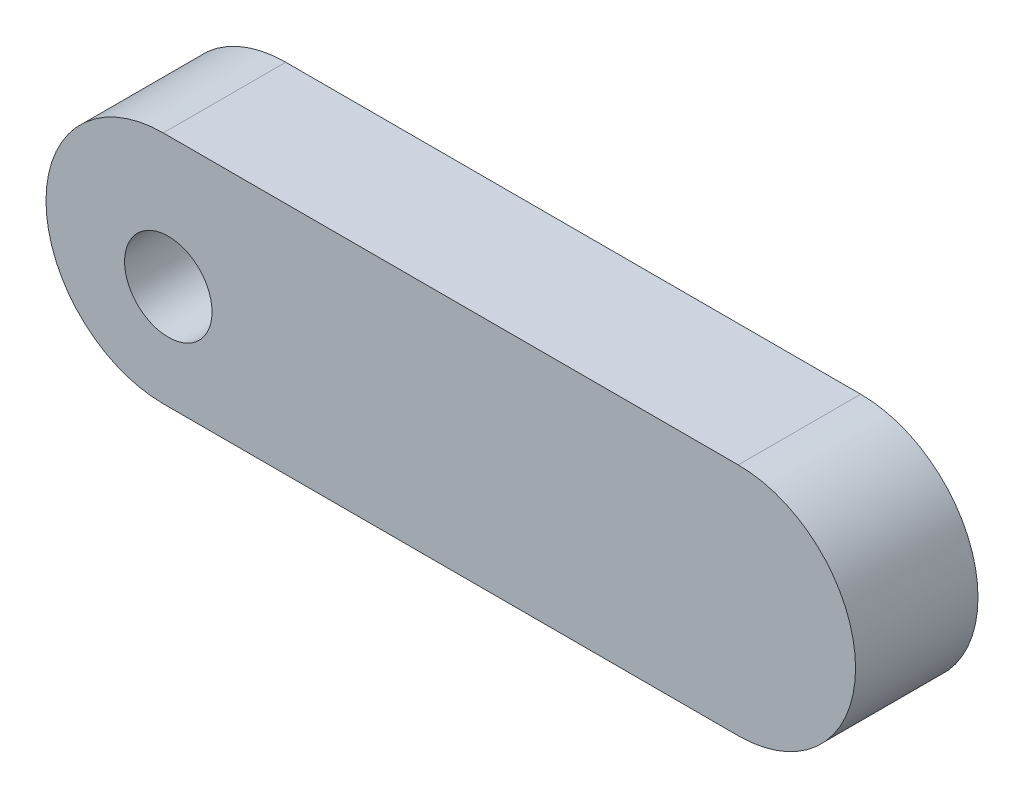
ISO-10303-21;
HEADER;
FILE_DESCRIPTION(('STEP AP214'),'2;1');
FILE_NAME('part.step','',(''),(''),'','','');
FILE_SCHEMA(('AUTOMOTIVE_DESIGN { 1 0 10303 214 1 1 1 1 }'));
ENDSEC;
DATA;
#1=APPLICATION_CONTEXT('core data for automotive mechanical design processes');
#2=APPLICATION_PROTOCOL_DEFINITION('international standard','automotive_design',2000,#1);
#3=PRODUCT_CONTEXT('',#1,'mechanical');
#4=PRODUCT('Part','Part','',(#3));
#5=PRODUCT_RELATED_PRODUCT_CATEGORY('part','',(#4));
#6=PRODUCT_DEFINITION_FORMATION('','',#4);
#7=PRODUCT_DEFINITION_CONTEXT('part definition',#1,'design');
#8=PRODUCT_DEFINITION('design','',#6,#7);
#9=PRODUCT_DEFINITION_SHAPE('','',#8);
#10=(LENGTH_UNIT() NAMED_UNIT(*) SI_UNIT(.MILLI.,.METRE.));
#11=(NAMED_UNIT(*) PLANE_ANGLE_UNIT() SI_UNIT($,.RADIAN.));
#12=(NAMED_UNIT(*) SI_UNIT($,.STERADIAN.) SOLID_ANGLE_UNIT());
#13=UNCERTAINTY_MEASURE_WITH_UNIT(LENGTH_MEASURE(1.E-05),#10,'distance_accuracy_value','');
#14=(GEOMETRIC_REPRESENTATION_CONTEXT(3) GLOBAL_UNCERTAINTY_ASSIGNED_CONTEXT((#13)) GLOBAL_UNIT_ASSIGNED_CONTEXT((#10,
#11,#12)) REPRESENTATION_CONTEXT('',''));
#15=CARTESIAN_POINT('',(0.,0.,0.));
#16=DIRECTION('',(0.,0.,1.));
#17=DIRECTION('',(1.,0.,0.));
#18=AXIS2_PLACEMENT_3D('',#15,#16,#17);
#19=CARTESIAN_POINT('',(0.,31.3770547142888,10.));
#20=DIRECTION('',(0.,1.,0.));
#21=DIRECTION('',(0.,0.,1.));
#22=AXIS2_PLACEMENT_3D('',#19,#20,#21);
#23=PLANE('',#22);
#24=DIRECTION('',(1.,0.,0.));
#25=VECTOR('',#24,1.);
#26=CARTESIAN_POINT('',(0.,31.3770547142888,0.));
#27=LINE('',#26,#25);
#28=CARTESIAN_POINT('',(-68.6434423785487,31.3770547142888,0.));
#29=VERTEX_POINT('',#28);
#30=CARTESIAN_POINT('',(-21.6917034055332,31.3770547142888,0.));
#31=VERTEX_POINT('',#30);
#32=EDGE_CURVE('E139',#29,#31,#27,.T.);
#33=ORIENTED_EDGE('',*,*,#32,.F.);
#34=DIRECTION('',(0.,0.,-1.));
#35=VECTOR('',#34,1.);
#36=CARTESIAN_POINT('',(-68.6434423785487,31.3770547142888,10.));
#37=LINE('',#36,#35);
#38=CARTESIAN_POINT('',(-68.6434423785487,31.3770547142888,10.));
#39=VERTEX_POINT('',#38);
#40=EDGE_CURVE('E99',#39,#29,#37,.T.);
#41=ORIENTED_EDGE('',*,*,#40,.F.);
#42=DIRECTION('',(1.,0.,0.));
#43=VECTOR('',#42,1.);
#44=CARTESIAN_POINT('',(0.,31.3770547142888,10.));
#45=LINE('',#44,#43);
#46=CARTESIAN_POINT('',(-21.6917034055332,31.3770547142888,10.));
#47=VERTEX_POINT('',#46);
#48=EDGE_CURVE('E112',#39,#47,#45,.T.);
#49=ORIENTED_EDGE('',*,*,#48,.T.);
#50=DIRECTION('',(0.,0.,-1.));
#51=VECTOR('',#50,1.);
#52=CARTESIAN_POINT('',(-21.6917034055332,31.3770547142888,10.));
#53=LINE('',#52,#51);
#54=EDGE_CURVE('E75',#47,#31,#53,.T.);
#55=ORIENTED_EDGE('',*,*,#54,.T.);
#56=EDGE_LOOP('',(#33,#41,#49,#55));
#57=FACE_BOUND('',#56,.T.);
#58=ADVANCED_FACE('F65',(#57),#23,.T.);
#59=CARTESIAN_POINT('',(0.,0.,0.));
#60=DIRECTION('',(0.,0.,1.));
#61=DIRECTION('',(1.,0.,0.));
#62=AXIS2_PLACEMENT_3D('',#59,#60,#61);
#63=PLANE('',#62);
#64=CARTESIAN_POINT('',(-68.2340523054714,20.7072039915549,0.));
#65=DIRECTION('',(0.,0.,1.));
#66=DIRECTION('',(1.,0.,0.));
#67=AXIS2_PLACEMENT_3D('',#64,#65,#66);
#68=CIRCLE('',#67,3.5705619411071);
#69=CARTESIAN_POINT('',(-64.6634903643643,20.7072039915549,0.));
#70=VERTEX_POINT('',#69);
#71=EDGE_CURVE('E136',#70,#70,#68,.T.);
#72=ORIENTED_EDGE('',*,*,#71,.T.);
#73=EDGE_LOOP('',(#72));
#74=FACE_BOUND('',#73,.T.);
#75=DIRECTION('',(1.,0.,0.));
#76=VECTOR('',#75,1.);
#77=CARTESIAN_POINT('',(0.,12.2207452132984,0.));
#78=LINE('',#77,#76);
#79=CARTESIAN_POINT('',(-68.6434423785487,12.2207452132984,0.));
#80=VERTEX_POINT('',#79);
#81=CARTESIAN_POINT('',(-21.6917034055332,12.2207452132984,0.));
#82=VERTEX_POINT('',#81);
#83=EDGE_CURVE('E132',#80,#82,#78,.T.);
#84=ORIENTED_EDGE('',*,*,#83,.F.);
#85=CARTESIAN_POINT('',(-68.6434423785487,21.7988999637936,0.));
#86=DIRECTION('',(0.,0.,1.));
#87=DIRECTION('',(1.,0.,0.));
#88=AXIS2_PLACEMENT_3D('',#85,#86,#87);
#89=CIRCLE('',#88,9.57815475049517);
#90=EDGE_CURVE('E102',#29,#80,#89,.T.);
#91=ORIENTED_EDGE('',*,*,#90,.F.);
#92=ORIENTED_EDGE('',*,*,#32,.T.);
#93=CARTESIAN_POINT('',(-21.6917034055332,21.7988999637936,0.));
#94=DIRECTION('',(0.,0.,1.));
#95=DIRECTION('',(1.,0.,0.));
#96=AXIS2_PLACEMENT_3D('',#93,#94,#95);
#97=CIRCLE('',#96,9.57815475049517);
#98=EDGE_CURVE('E120',#82,#31,#97,.T.);
#99=ORIENTED_EDGE('',*,*,#98,.F.);
#100=EDGE_LOOP('',(#84,#91,#92,#99));
#101=FACE_BOUND('',#100,.T.);
#102=ADVANCED_FACE('F150',(#74,#101),#63,.F.);
#103=CARTESIAN_POINT('',(-21.6917034055332,21.7988999637936,10.));
#104=DIRECTION('',(0.,0.,-1.));
#105=DIRECTION('',(-1.,0.,0.));
#106=AXIS2_PLACEMENT_3D('',#103,#104,#105);
#107=CYLINDRICAL_SURFACE('',#106,9.57815475049517);
#108=ORIENTED_EDGE('',*,*,#98,.T.);
#109=ORIENTED_EDGE('',*,*,#54,.F.);
#110=CARTESIAN_POINT('',(-21.6917034055332,21.7988999637936,10.));
#111=DIRECTION('',(0.,0.,1.));
#112=DIRECTION('',(1.,0.,0.));
#113=AXIS2_PLACEMENT_3D('',#110,#111,#112);
#114=CIRCLE('',#113,9.57815475049517);
#115=CARTESIAN_POINT('',(-21.6917034055332,12.2207452132984,10.));
#116=VERTEX_POINT('',#115);
#117=EDGE_CURVE('E109',#116,#47,#114,.T.);
#118=ORIENTED_EDGE('',*,*,#117,.F.);
#119=DIRECTION('',(0.,0.,-1.));
#120=VECTOR('',#119,1.);
#121=CARTESIAN_POINT('',(-21.6917034055332,12.2207452132984,10.));
#122=LINE('',#121,#120);
#123=EDGE_CURVE('E12',#116,#82,#122,.T.);
#124=ORIENTED_EDGE('',*,*,#123,.T.);
#125=EDGE_LOOP('',(#108,#109,#118,#124));
#126=FACE_BOUND('',#125,.T.);
#127=ADVANCED_FACE('F119',(#126),#107,.T.);
#128=CARTESIAN_POINT('',(0.,12.2207452132984,10.));
#129=DIRECTION('',(0.,1.,0.));
#130=DIRECTION('',(0.,0.,1.));
#131=AXIS2_PLACEMENT_3D('',#128,#129,#130);
#132=PLANE('',#131);
#133=ORIENTED_EDGE('',*,*,#83,.T.);
#134=ORIENTED_EDGE('',*,*,#123,.F.);
#135=DIRECTION('',(1.,0.,0.));
#136=VECTOR('',#135,1.);
#137=CARTESIAN_POINT('',(0.,12.2207452132984,10.));
#138=LINE('',#137,#136);
#139=CARTESIAN_POINT('',(-68.6434423785487,12.2207452132984,10.));
#140=VERTEX_POINT('',#139);
#141=EDGE_CURVE('E114',#140,#116,#138,.T.);
#142=ORIENTED_EDGE('',*,*,#141,.F.);
#143=DIRECTION('',(0.,0.,-1.));
#144=VECTOR('',#143,1.);
#145=CARTESIAN_POINT('',(-68.6434423785487,12.2207452132984,10.));
#146=LINE('',#145,#144);
#147=EDGE_CURVE('E128',#140,#80,#146,.T.);
#148=ORIENTED_EDGE('',*,*,#147,.T.);
#149=EDGE_LOOP('',(#133,#134,#142,#148));
#150=FACE_BOUND('',#149,.T.);
#151=ADVANCED_FACE('F67',(#150),#132,.F.);
#152=CARTESIAN_POINT('',(-68.6434423785487,21.7988999637936,10.));
#153=DIRECTION('',(0.,0.,-1.));
#154=DIRECTION('',(-1.,0.,0.));
#155=AXIS2_PLACEMENT_3D('',#152,#153,#154);
#156=CYLINDRICAL_SURFACE('',#155,9.57815475049517);
#157=ORIENTED_EDGE('',*,*,#90,.T.);
#158=ORIENTED_EDGE('',*,*,#147,.F.);
#159=CARTESIAN_POINT('',(-68.6434423785487,21.7988999637936,10.));
#160=DIRECTION('',(0.,0.,1.));
#161=DIRECTION('',(1.,0.,0.));
#162=AXIS2_PLACEMENT_3D('',#159,#160,#161);
#163=CIRCLE('',#162,9.57815475049517);
#164=EDGE_CURVE('E83',#39,#140,#163,.T.);
#165=ORIENTED_EDGE('',*,*,#164,.F.);
#166=ORIENTED_EDGE('',*,*,#40,.T.);
#167=EDGE_LOOP('',(#157,#158,#165,#166));
#168=FACE_BOUND('',#167,.T.);
#169=ADVANCED_FACE('F163',(#168),#156,.T.);
#170=CARTESIAN_POINT('',(0.,0.,10.));
#171=DIRECTION('',(0.,0.,1.));
#172=DIRECTION('',(1.,0.,0.));
#173=AXIS2_PLACEMENT_3D('',#170,#171,#172);
#174=PLANE('',#173);
#175=CARTESIAN_POINT('',(-68.2340523054714,20.7072039915549,10.));
#176=DIRECTION('',(0.,0.,1.));
#177=DIRECTION('',(1.,0.,0.));
#178=AXIS2_PLACEMENT_3D('',#175,#176,#177);
#179=CIRCLE('',#178,3.5705619411071);
#180=CARTESIAN_POINT('',(-64.6634903643643,20.7072039915549,10.));
#181=VERTEX_POINT('',#180);
#182=EDGE_CURVE('E218',#181,#181,#179,.T.);
#183=ORIENTED_EDGE('',*,*,#182,.F.);
#184=EDGE_LOOP('',(#183));
#185=FACE_BOUND('',#184,.T.);
#186=ORIENTED_EDGE('',*,*,#141,.T.);
#187=ORIENTED_EDGE('',*,*,#117,.T.);
#188=ORIENTED_EDGE('',*,*,#48,.F.);
#189=ORIENTED_EDGE('',*,*,#164,.T.);
#190=EDGE_LOOP('',(#186,#187,#188,#189));
#191=FACE_BOUND('',#190,.T.);
#192=ADVANCED_FACE('F110',(#185,#191),#174,.T.);
#193=CARTESIAN_POINT('',(-68.2340523054714,20.7072039915549,0.));
#194=DIRECTION('',(0.,0.,1.));
#195=DIRECTION('',(1.,0.,0.));
#196=AXIS2_PLACEMENT_3D('',#193,#194,#195);
#197=CYLINDRICAL_SURFACE('',#196,3.5705619411071);
#198=ORIENTED_EDGE('',*,*,#71,.F.);
#199=EDGE_LOOP('',(#198));
#200=FACE_BOUND('',#199,.T.);
#201=ORIENTED_EDGE('',*,*,#182,.T.);
#202=EDGE_LOOP('',(#201));
#203=FACE_BOUND('',#202,.T.);
#204=ADVANCED_FACE('F169',(#200,#203),#197,.F.);
#205=CLOSED_SHELL('',(#58,#102,#127,#151,#169,#192,#204));
#206=MANIFOLD_SOLID_BREP('B2',#205);
#207=ADVANCED_BREP_SHAPE_REPRESENTATION('',(#18,#206),#14);
#208=SHAPE_DEFINITION_REPRESENTATION(#9,#207);
ENDSEC;
END-ISO-10303-21;
